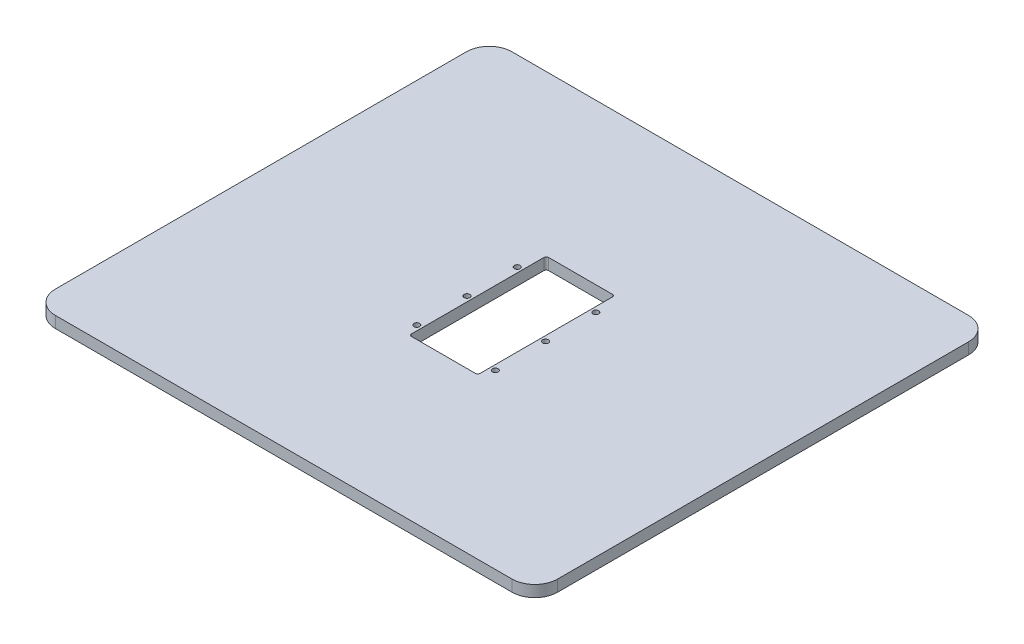
ISO-10303-21;
HEADER;
FILE_DESCRIPTION(('STEP AP214'),'2;1');
FILE_NAME('part.step','',(''),(''),'','','');
FILE_SCHEMA(('AUTOMOTIVE_DESIGN { 1 0 10303 214 1 1 1 1 }'));
ENDSEC;
DATA;
#1=APPLICATION_CONTEXT('core data for automotive mechanical design processes');
#2=APPLICATION_PROTOCOL_DEFINITION('international standard','automotive_design',2000,#1);
#3=PRODUCT_CONTEXT('',#1,'mechanical');
#4=PRODUCT('Part','Part','',(#3));
#5=PRODUCT_RELATED_PRODUCT_CATEGORY('part','',(#4));
#6=PRODUCT_DEFINITION_FORMATION('','',#4);
#7=PRODUCT_DEFINITION_CONTEXT('part definition',#1,'design');
#8=PRODUCT_DEFINITION('design','',#6,#7);
#9=PRODUCT_DEFINITION_SHAPE('','',#8);
#10=(LENGTH_UNIT() NAMED_UNIT(*) SI_UNIT(.MILLI.,.METRE.));
#11=(NAMED_UNIT(*) PLANE_ANGLE_UNIT() SI_UNIT($,.RADIAN.));
#12=(NAMED_UNIT(*) SI_UNIT($,.STERADIAN.) SOLID_ANGLE_UNIT());
#13=UNCERTAINTY_MEASURE_WITH_UNIT(LENGTH_MEASURE(1.E-05),#10,'distance_accuracy_value','');
#14=(GEOMETRIC_REPRESENTATION_CONTEXT(3) GLOBAL_UNCERTAINTY_ASSIGNED_CONTEXT((#13)) GLOBAL_UNIT_ASSIGNED_CONTEXT((#10,
#11,#12)) REPRESENTATION_CONTEXT('',''));
#15=CARTESIAN_POINT('',(0.,0.,0.));
#16=DIRECTION('',(0.,0.,1.));
#17=DIRECTION('',(1.,0.,0.));
#18=AXIS2_PLACEMENT_3D('',#15,#16,#17);
#19=CARTESIAN_POINT('',(99.9999999999998,5.,90.));
#20=DIRECTION('',(0.,1.,0.));
#21=DIRECTION('',(0.,0.,1.));
#22=AXIS2_PLACEMENT_3D('',#19,#20,#21);
#23=PLANE('',#22);
#24=CARTESIAN_POINT('',(-17.2,5.,2.50000000000002));
#25=DIRECTION('',(0.,1.,0.));
#26=DIRECTION('',(0.,0.,-1.));
#27=AXIS2_PLACEMENT_3D('',#24,#25,#26);
#28=CIRCLE('',#27,1.24999999999999);
#29=CARTESIAN_POINT('',(-17.2,5.,1.25000000000003));
#30=VERTEX_POINT('',#29);
#31=EDGE_CURVE('E416',#30,#30,#28,.T.);
#32=ORIENTED_EDGE('',*,*,#31,.F.);
#33=EDGE_LOOP('',(#32));
#34=FACE_BOUND('',#33,.T.);
#35=CARTESIAN_POINT('',(17.2,5.,24.5));
#36=DIRECTION('',(0.,1.,0.));
#37=DIRECTION('',(0.,0.,1.));
#38=AXIS2_PLACEMENT_3D('',#35,#36,#37);
#39=CIRCLE('',#38,1.25);
#40=CARTESIAN_POINT('',(17.2,5.,25.75));
#41=VERTEX_POINT('',#40);
#42=EDGE_CURVE('E184',#41,#41,#39,.T.);
#43=ORIENTED_EDGE('',*,*,#42,.F.);
#44=EDGE_LOOP('',(#43));
#45=FACE_BOUND('',#44,.T.);
#46=CARTESIAN_POINT('',(17.2,5.,-19.5));
#47=DIRECTION('',(0.,1.,0.));
#48=DIRECTION('',(0.,0.,1.));
#49=AXIS2_PLACEMENT_3D('',#46,#47,#48);
#50=CIRCLE('',#49,1.25);
#51=CARTESIAN_POINT('',(17.2,5.,-18.25));
#52=VERTEX_POINT('',#51);
#53=EDGE_CURVE('E220',#52,#52,#50,.T.);
#54=ORIENTED_EDGE('',*,*,#53,.F.);
#55=EDGE_LOOP('',(#54));
#56=FACE_BOUND('',#55,.T.);
#57=CARTESIAN_POINT('',(99.9999999999998,5.,90.));
#58=DIRECTION('',(0.,1.,0.));
#59=DIRECTION('',(0.,0.,1.));
#60=AXIS2_PLACEMENT_3D('',#57,#58,#59);
#61=CIRCLE('',#60,10.);
#62=CARTESIAN_POINT('',(99.9999999999998,5.,100.));
#63=VERTEX_POINT('',#62);
#64=CARTESIAN_POINT('',(110.,5.,90.));
#65=VERTEX_POINT('',#64);
#66=EDGE_CURVE('E226',#63,#65,#61,.T.);
#67=ORIENTED_EDGE('',*,*,#66,.T.);
#68=DIRECTION('',(0.,0.,-1.));
#69=VECTOR('',#68,1.);
#70=CARTESIAN_POINT('',(110.,5.,90.));
#71=LINE('',#70,#69);
#72=CARTESIAN_POINT('',(110.,5.,-90.));
#73=VERTEX_POINT('',#72);
#74=EDGE_CURVE('E229',#65,#73,#71,.T.);
#75=ORIENTED_EDGE('',*,*,#74,.T.);
#76=CARTESIAN_POINT('',(99.9999999999998,5.,-90.));
#77=DIRECTION('',(0.,1.,0.));
#78=DIRECTION('',(0.,0.,1.));
#79=AXIS2_PLACEMENT_3D('',#76,#77,#78);
#80=CIRCLE('',#79,10.);
#81=CARTESIAN_POINT('',(99.9999999999998,5.,-100.));
#82=VERTEX_POINT('',#81);
#83=EDGE_CURVE('E232',#73,#82,#80,.T.);
#84=ORIENTED_EDGE('',*,*,#83,.T.);
#85=DIRECTION('',(-1.,0.,0.));
#86=VECTOR('',#85,1.);
#87=CARTESIAN_POINT('',(99.9999999999998,5.,-100.));
#88=LINE('',#87,#86);
#89=CARTESIAN_POINT('',(-100.,5.,-100.));
#90=VERTEX_POINT('',#89);
#91=EDGE_CURVE('E234',#82,#90,#88,.T.);
#92=ORIENTED_EDGE('',*,*,#91,.T.);
#93=CARTESIAN_POINT('',(-100.,5.,-90.));
#94=DIRECTION('',(0.,1.,0.));
#95=DIRECTION('',(0.,0.,1.));
#96=AXIS2_PLACEMENT_3D('',#93,#94,#95);
#97=CIRCLE('',#96,10.);
#98=CARTESIAN_POINT('',(-110.,5.,-90.));
#99=VERTEX_POINT('',#98);
#100=EDGE_CURVE('E236',#90,#99,#97,.T.);
#101=ORIENTED_EDGE('',*,*,#100,.T.);
#102=DIRECTION('',(0.,0.,1.));
#103=VECTOR('',#102,1.);
#104=CARTESIAN_POINT('',(-110.,5.,90.));
#105=LINE('',#104,#103);
#106=CARTESIAN_POINT('',(-110.,5.,90.));
#107=VERTEX_POINT('',#106);
#108=EDGE_CURVE('E238',#99,#107,#105,.T.);
#109=ORIENTED_EDGE('',*,*,#108,.T.);
#110=CARTESIAN_POINT('',(-100.,5.,90.));
#111=DIRECTION('',(0.,1.,0.));
#112=DIRECTION('',(0.,0.,-1.));
#113=AXIS2_PLACEMENT_3D('',#110,#111,#112);
#114=CIRCLE('',#113,10.);
#115=CARTESIAN_POINT('',(-100.,5.,100.));
#116=VERTEX_POINT('',#115);
#117=EDGE_CURVE('E240',#107,#116,#114,.T.);
#118=ORIENTED_EDGE('',*,*,#117,.T.);
#119=DIRECTION('',(1.,0.,0.));
#120=VECTOR('',#119,1.);
#121=CARTESIAN_POINT('',(99.9999999999998,5.,100.));
#122=LINE('',#121,#120);
#123=EDGE_CURVE('E242',#116,#63,#122,.T.);
#124=ORIENTED_EDGE('',*,*,#123,.T.);
#125=EDGE_LOOP('',(#67,#75,#84,#92,#101,#109,#118,#124));
#126=FACE_BOUND('',#125,.T.);
#127=CARTESIAN_POINT('',(17.2,5.,2.50000000000002));
#128=DIRECTION('',(0.,1.,0.));
#129=DIRECTION('',(0.,0.,1.));
#130=AXIS2_PLACEMENT_3D('',#127,#128,#129);
#131=CIRCLE('',#130,1.25);
#132=CARTESIAN_POINT('',(17.2,5.,3.75000000000002));
#133=VERTEX_POINT('',#132);
#134=EDGE_CURVE('E214',#133,#133,#131,.T.);
#135=ORIENTED_EDGE('',*,*,#134,.F.);
#136=EDGE_LOOP('',(#135));
#137=FACE_BOUND('',#136,.T.);
#138=DIRECTION('',(0.,0.,-1.));
#139=VECTOR('',#138,1.);
#140=CARTESIAN_POINT('',(15.,5.,-29.));
#141=LINE('',#140,#139);
#142=CARTESIAN_POINT('',(15.,5.,29.));
#143=VERTEX_POINT('',#142);
#144=CARTESIAN_POINT('',(15.,5.,-29.));
#145=VERTEX_POINT('',#144);
#146=EDGE_CURVE('E154',#143,#145,#141,.T.);
#147=ORIENTED_EDGE('',*,*,#146,.F.);
#148=CARTESIAN_POINT('',(14.,5.,29.));
#149=DIRECTION('',(0.,1.,0.));
#150=DIRECTION('',(0.,0.,-1.));
#151=AXIS2_PLACEMENT_3D('',#148,#149,#150);
#152=CIRCLE('',#151,0.999999999999999);
#153=CARTESIAN_POINT('',(14.,5.,30.));
#154=VERTEX_POINT('',#153);
#155=EDGE_CURVE('E146',#154,#143,#152,.T.);
#156=ORIENTED_EDGE('',*,*,#155,.F.);
#157=DIRECTION('',(1.,0.,0.));
#158=VECTOR('',#157,1.);
#159=CARTESIAN_POINT('',(14.,5.,30.));
#160=LINE('',#159,#158);
#161=CARTESIAN_POINT('',(-14.,5.,30.));
#162=VERTEX_POINT('',#161);
#163=EDGE_CURVE('E181',#162,#154,#160,.T.);
#164=ORIENTED_EDGE('',*,*,#163,.F.);
#165=CARTESIAN_POINT('',(-14.,5.,29.));
#166=DIRECTION('',(0.,1.,0.));
#167=DIRECTION('',(0.,0.,-1.));
#168=AXIS2_PLACEMENT_3D('',#165,#166,#167);
#169=CIRCLE('',#168,0.999999999999999);
#170=CARTESIAN_POINT('',(-15.,5.,29.));
#171=VERTEX_POINT('',#170);
#172=EDGE_CURVE('E179',#171,#162,#169,.T.);
#173=ORIENTED_EDGE('',*,*,#172,.F.);
#174=DIRECTION('',(0.,0.,1.));
#175=VECTOR('',#174,1.);
#176=CARTESIAN_POINT('',(-15.,5.,-29.));
#177=LINE('',#176,#175);
#178=CARTESIAN_POINT('',(-15.,5.,-29.));
#179=VERTEX_POINT('',#178);
#180=EDGE_CURVE('E177',#179,#171,#177,.T.);
#181=ORIENTED_EDGE('',*,*,#180,.F.);
#182=CARTESIAN_POINT('',(-14.,5.,-29.));
#183=DIRECTION('',(0.,1.,0.));
#184=DIRECTION('',(0.,0.,1.));
#185=AXIS2_PLACEMENT_3D('',#182,#183,#184);
#186=CIRCLE('',#185,0.999999999999997);
#187=CARTESIAN_POINT('',(-14.,5.,-30.));
#188=VERTEX_POINT('',#187);
#189=EDGE_CURVE('E175',#188,#179,#186,.T.);
#190=ORIENTED_EDGE('',*,*,#189,.F.);
#191=DIRECTION('',(-1.,0.,0.));
#192=VECTOR('',#191,1.);
#193=CARTESIAN_POINT('',(14.,5.,-30.));
#194=LINE('',#193,#192);
#195=CARTESIAN_POINT('',(14.,5.,-30.));
#196=VERTEX_POINT('',#195);
#197=EDGE_CURVE('E170',#196,#188,#194,.T.);
#198=ORIENTED_EDGE('',*,*,#197,.F.);
#199=CARTESIAN_POINT('',(14.,5.,-29.));
#200=DIRECTION('',(0.,1.,0.));
#201=DIRECTION('',(0.,0.,-1.));
#202=AXIS2_PLACEMENT_3D('',#199,#200,#201);
#203=CIRCLE('',#202,0.999999999999997);
#204=EDGE_CURVE('E168',#145,#196,#203,.T.);
#205=ORIENTED_EDGE('',*,*,#204,.F.);
#206=EDGE_LOOP('',(#147,#156,#164,#173,#181,#190,#198,#205));
#207=FACE_BOUND('',#206,.T.);
#208=CARTESIAN_POINT('',(-17.2,5.,24.5));
#209=DIRECTION('',(0.,1.,0.));
#210=DIRECTION('',(0.,0.,-1.));
#211=AXIS2_PLACEMENT_3D('',#208,#209,#210);
#212=CIRCLE('',#211,1.24999999999999);
#213=CARTESIAN_POINT('',(-17.2,5.,23.25));
#214=VERTEX_POINT('',#213);
#215=EDGE_CURVE('E422',#214,#214,#212,.T.);
#216=ORIENTED_EDGE('',*,*,#215,.F.);
#217=EDGE_LOOP('',(#216));
#218=FACE_BOUND('',#217,.T.);
#219=CARTESIAN_POINT('',(-17.2,5.,-19.5));
#220=DIRECTION('',(0.,1.,0.));
#221=DIRECTION('',(0.,0.,-1.));
#222=AXIS2_PLACEMENT_3D('',#219,#220,#221);
#223=CIRCLE('',#222,1.24999999999999);
#224=CARTESIAN_POINT('',(-17.2,5.,-20.75));
#225=VERTEX_POINT('',#224);
#226=EDGE_CURVE('E407',#225,#225,#223,.T.);
#227=ORIENTED_EDGE('',*,*,#226,.F.);
#228=EDGE_LOOP('',(#227));
#229=FACE_BOUND('',#228,.T.);
#230=ADVANCED_FACE('F33',(#34,#45,#56,#126,#137,#207,#218,#229),#23,.T.);
#231=CARTESIAN_POINT('',(99.9999999999998,0.,90.));
#232=DIRECTION('',(0.,1.,0.));
#233=DIRECTION('',(0.,0.,1.));
#234=AXIS2_PLACEMENT_3D('',#231,#232,#233);
#235=PLANE('',#234);
#236=CARTESIAN_POINT('',(17.2,0.,2.50000000000002));
#237=DIRECTION('',(0.,1.,0.));
#238=DIRECTION('',(0.,0.,1.));
#239=AXIS2_PLACEMENT_3D('',#236,#237,#238);
#240=CIRCLE('',#239,1.25);
#241=CARTESIAN_POINT('',(17.2,0.,3.75000000000002));
#242=VERTEX_POINT('',#241);
#243=EDGE_CURVE('E162',#242,#242,#240,.T.);
#244=ORIENTED_EDGE('',*,*,#243,.T.);
#245=EDGE_LOOP('',(#244));
#246=FACE_BOUND('',#245,.T.);
#247=CARTESIAN_POINT('',(17.2,0.,-19.5));
#248=DIRECTION('',(0.,1.,0.));
#249=DIRECTION('',(0.,0.,1.));
#250=AXIS2_PLACEMENT_3D('',#247,#248,#249);
#251=CIRCLE('',#250,1.25);
#252=CARTESIAN_POINT('',(17.2,0.,-18.25));
#253=VERTEX_POINT('',#252);
#254=EDGE_CURVE('E217',#253,#253,#251,.T.);
#255=ORIENTED_EDGE('',*,*,#254,.T.);
#256=EDGE_LOOP('',(#255));
#257=FACE_BOUND('',#256,.T.);
#258=CARTESIAN_POINT('',(99.9999999999998,0.,90.));
#259=DIRECTION('',(0.,1.,0.));
#260=DIRECTION('',(0.,0.,1.));
#261=AXIS2_PLACEMENT_3D('',#258,#259,#260);
#262=CIRCLE('',#261,10.);
#263=CARTESIAN_POINT('',(99.9999999999998,0.,100.));
#264=VERTEX_POINT('',#263);
#265=CARTESIAN_POINT('',(110.,0.,90.));
#266=VERTEX_POINT('',#265);
#267=EDGE_CURVE('E223',#264,#266,#262,.T.);
#268=ORIENTED_EDGE('',*,*,#267,.F.);
#269=DIRECTION('',(1.,0.,0.));
#270=VECTOR('',#269,1.);
#271=CARTESIAN_POINT('',(99.9999999999998,0.,100.));
#272=LINE('',#271,#270);
#273=CARTESIAN_POINT('',(-100.,0.,100.));
#274=VERTEX_POINT('',#273);
#275=EDGE_CURVE('E230',#274,#264,#272,.T.);
#276=ORIENTED_EDGE('',*,*,#275,.F.);
#277=CARTESIAN_POINT('',(-100.,0.,90.));
#278=DIRECTION('',(0.,1.,0.));
#279=DIRECTION('',(0.,0.,-1.));
#280=AXIS2_PLACEMENT_3D('',#277,#278,#279);
#281=CIRCLE('',#280,10.);
#282=CARTESIAN_POINT('',(-110.,0.,90.));
#283=VERTEX_POINT('',#282);
#284=EDGE_CURVE('E257',#283,#274,#281,.T.);
#285=ORIENTED_EDGE('',*,*,#284,.F.);
#286=DIRECTION('',(0.,0.,1.));
#287=VECTOR('',#286,1.);
#288=CARTESIAN_POINT('',(-110.,0.,90.));
#289=LINE('',#288,#287);
#290=CARTESIAN_POINT('',(-110.,0.,-90.));
#291=VERTEX_POINT('',#290);
#292=EDGE_CURVE('E255',#291,#283,#289,.T.);
#293=ORIENTED_EDGE('',*,*,#292,.F.);
#294=CARTESIAN_POINT('',(-100.,0.,-90.));
#295=DIRECTION('',(0.,1.,0.));
#296=DIRECTION('',(0.,0.,1.));
#297=AXIS2_PLACEMENT_3D('',#294,#295,#296);
#298=CIRCLE('',#297,10.);
#299=CARTESIAN_POINT('',(-100.,0.,-100.));
#300=VERTEX_POINT('',#299);
#301=EDGE_CURVE('E253',#300,#291,#298,.T.);
#302=ORIENTED_EDGE('',*,*,#301,.F.);
#303=DIRECTION('',(-1.,0.,0.));
#304=VECTOR('',#303,1.);
#305=CARTESIAN_POINT('',(99.9999999999998,0.,-100.));
#306=LINE('',#305,#304);
#307=CARTESIAN_POINT('',(99.9999999999998,0.,-100.));
#308=VERTEX_POINT('',#307);
#309=EDGE_CURVE('E251',#308,#300,#306,.T.);
#310=ORIENTED_EDGE('',*,*,#309,.F.);
#311=CARTESIAN_POINT('',(99.9999999999998,0.,-90.));
#312=DIRECTION('',(0.,1.,0.));
#313=DIRECTION('',(0.,0.,1.));
#314=AXIS2_PLACEMENT_3D('',#311,#312,#313);
#315=CIRCLE('',#314,10.);
#316=CARTESIAN_POINT('',(110.,0.,-90.));
#317=VERTEX_POINT('',#316);
#318=EDGE_CURVE('E249',#317,#308,#315,.T.);
#319=ORIENTED_EDGE('',*,*,#318,.F.);
#320=DIRECTION('',(0.,0.,-1.));
#321=VECTOR('',#320,1.);
#322=CARTESIAN_POINT('',(110.,0.,90.));
#323=LINE('',#322,#321);
#324=EDGE_CURVE('E247',#266,#317,#323,.T.);
#325=ORIENTED_EDGE('',*,*,#324,.F.);
#326=EDGE_LOOP('',(#268,#276,#285,#293,#302,#310,#319,#325));
#327=FACE_BOUND('',#326,.T.);
#328=CARTESIAN_POINT('',(14.,0.,29.));
#329=DIRECTION('',(0.,1.,0.));
#330=DIRECTION('',(0.,0.,-1.));
#331=AXIS2_PLACEMENT_3D('',#328,#329,#330);
#332=CIRCLE('',#331,0.999999999999999);
#333=CARTESIAN_POINT('',(14.,0.,30.));
#334=VERTEX_POINT('',#333);
#335=CARTESIAN_POINT('',(15.,0.,29.));
#336=VERTEX_POINT('',#335);
#337=EDGE_CURVE('E56',#334,#336,#332,.T.);
#338=ORIENTED_EDGE('',*,*,#337,.T.);
#339=DIRECTION('',(0.,0.,-1.));
#340=VECTOR('',#339,1.);
#341=CARTESIAN_POINT('',(15.,0.,-29.));
#342=LINE('',#341,#340);
#343=CARTESIAN_POINT('',(15.,0.,-29.));
#344=VERTEX_POINT('',#343);
#345=EDGE_CURVE('E161',#336,#344,#342,.T.);
#346=ORIENTED_EDGE('',*,*,#345,.T.);
#347=CARTESIAN_POINT('',(14.,0.,-29.));
#348=DIRECTION('',(0.,1.,0.));
#349=DIRECTION('',(0.,0.,-1.));
#350=AXIS2_PLACEMENT_3D('',#347,#348,#349);
#351=CIRCLE('',#350,0.999999999999997);
#352=CARTESIAN_POINT('',(14.,0.,-30.));
#353=VERTEX_POINT('',#352);
#354=EDGE_CURVE('E186',#344,#353,#351,.T.);
#355=ORIENTED_EDGE('',*,*,#354,.T.);
#356=DIRECTION('',(-1.,0.,0.));
#357=VECTOR('',#356,1.);
#358=CARTESIAN_POINT('',(14.,0.,-30.));
#359=LINE('',#358,#357);
#360=CARTESIAN_POINT('',(-14.,0.,-30.));
#361=VERTEX_POINT('',#360);
#362=EDGE_CURVE('E189',#353,#361,#359,.T.);
#363=ORIENTED_EDGE('',*,*,#362,.T.);
#364=CARTESIAN_POINT('',(-14.,0.,-29.));
#365=DIRECTION('',(0.,1.,0.));
#366=DIRECTION('',(0.,0.,1.));
#367=AXIS2_PLACEMENT_3D('',#364,#365,#366);
#368=CIRCLE('',#367,0.999999999999997);
#369=CARTESIAN_POINT('',(-15.,0.,-29.));
#370=VERTEX_POINT('',#369);
#371=EDGE_CURVE('E192',#361,#370,#368,.T.);
#372=ORIENTED_EDGE('',*,*,#371,.T.);
#373=DIRECTION('',(0.,0.,1.));
#374=VECTOR('',#373,1.);
#375=CARTESIAN_POINT('',(-15.,0.,-29.));
#376=LINE('',#375,#374);
#377=CARTESIAN_POINT('',(-15.,0.,29.));
#378=VERTEX_POINT('',#377);
#379=EDGE_CURVE('E195',#370,#378,#376,.T.);
#380=ORIENTED_EDGE('',*,*,#379,.T.);
#381=CARTESIAN_POINT('',(-14.,0.,29.));
#382=DIRECTION('',(0.,1.,0.));
#383=DIRECTION('',(0.,0.,-1.));
#384=AXIS2_PLACEMENT_3D('',#381,#382,#383);
#385=CIRCLE('',#384,0.999999999999999);
#386=CARTESIAN_POINT('',(-14.,0.,30.));
#387=VERTEX_POINT('',#386);
#388=EDGE_CURVE('E198',#378,#387,#385,.T.);
#389=ORIENTED_EDGE('',*,*,#388,.T.);
#390=DIRECTION('',(1.,0.,0.));
#391=VECTOR('',#390,1.);
#392=CARTESIAN_POINT('',(14.,0.,30.));
#393=LINE('',#392,#391);
#394=EDGE_CURVE('E155',#387,#334,#393,.T.);
#395=ORIENTED_EDGE('',*,*,#394,.T.);
#396=EDGE_LOOP('',(#338,#346,#355,#363,#372,#380,#389,#395));
#397=FACE_BOUND('',#396,.T.);
#398=CARTESIAN_POINT('',(17.2,0.,24.5));
#399=DIRECTION('',(0.,1.,0.));
#400=DIRECTION('',(0.,0.,1.));
#401=AXIS2_PLACEMENT_3D('',#398,#399,#400);
#402=CIRCLE('',#401,1.25);
#403=CARTESIAN_POINT('',(17.2,0.,25.75));
#404=VERTEX_POINT('',#403);
#405=EDGE_CURVE('E425',#404,#404,#402,.T.);
#406=ORIENTED_EDGE('',*,*,#405,.T.);
#407=EDGE_LOOP('',(#406));
#408=FACE_BOUND('',#407,.T.);
#409=CARTESIAN_POINT('',(-17.2,0.,24.5));
#410=DIRECTION('',(0.,1.,0.));
#411=DIRECTION('',(0.,0.,-1.));
#412=AXIS2_PLACEMENT_3D('',#409,#410,#411);
#413=CIRCLE('',#412,1.24999999999999);
#414=CARTESIAN_POINT('',(-17.2,0.,23.25));
#415=VERTEX_POINT('',#414);
#416=EDGE_CURVE('E419',#415,#415,#413,.T.);
#417=ORIENTED_EDGE('',*,*,#416,.T.);
#418=EDGE_LOOP('',(#417));
#419=FACE_BOUND('',#418,.T.);
#420=CARTESIAN_POINT('',(-17.2,0.,2.50000000000002));
#421=DIRECTION('',(0.,1.,0.));
#422=DIRECTION('',(0.,0.,-1.));
#423=AXIS2_PLACEMENT_3D('',#420,#421,#422);
#424=CIRCLE('',#423,1.24999999999999);
#425=CARTESIAN_POINT('',(-17.2,0.,1.25000000000003));
#426=VERTEX_POINT('',#425);
#427=EDGE_CURVE('E413',#426,#426,#424,.T.);
#428=ORIENTED_EDGE('',*,*,#427,.T.);
#429=EDGE_LOOP('',(#428));
#430=FACE_BOUND('',#429,.T.);
#431=CARTESIAN_POINT('',(-17.2,0.,-19.5));
#432=DIRECTION('',(0.,1.,0.));
#433=DIRECTION('',(0.,0.,-1.));
#434=AXIS2_PLACEMENT_3D('',#431,#432,#433);
#435=CIRCLE('',#434,1.24999999999999);
#436=CARTESIAN_POINT('',(-17.2,0.,-20.75));
#437=VERTEX_POINT('',#436);
#438=EDGE_CURVE('E410',#437,#437,#435,.T.);
#439=ORIENTED_EDGE('',*,*,#438,.T.);
#440=EDGE_LOOP('',(#439));
#441=FACE_BOUND('',#440,.T.);
#442=ADVANCED_FACE('F287',(#246,#257,#327,#397,#408,#419,#430,#441),#235,.F.);
#443=CARTESIAN_POINT('',(99.9999999999998,5.,90.));
#444=DIRECTION('',(0.,-1.,0.));
#445=DIRECTION('',(0.,0.,-1.));
#446=AXIS2_PLACEMENT_3D('',#443,#444,#445);
#447=CYLINDRICAL_SURFACE('',#446,10.);
#448=ORIENTED_EDGE('',*,*,#267,.T.);
#449=DIRECTION('',(0.,-1.,0.));
#450=VECTOR('',#449,1.);
#451=CARTESIAN_POINT('',(110.,5.,90.));
#452=LINE('',#451,#450);
#453=EDGE_CURVE('E11',#65,#266,#452,.T.);
#454=ORIENTED_EDGE('',*,*,#453,.F.);
#455=ORIENTED_EDGE('',*,*,#66,.F.);
#456=DIRECTION('',(0.,-1.,0.));
#457=VECTOR('',#456,1.);
#458=CARTESIAN_POINT('',(99.9999999999998,5.,100.));
#459=LINE('',#458,#457);
#460=EDGE_CURVE('E244',#63,#264,#459,.T.);
#461=ORIENTED_EDGE('',*,*,#460,.T.);
#462=EDGE_LOOP('',(#448,#454,#455,#461));
#463=FACE_BOUND('',#462,.T.);
#464=ADVANCED_FACE('F35',(#463),#447,.T.);
#465=CARTESIAN_POINT('',(110.,5.,90.));
#466=DIRECTION('',(-1.,0.,0.));
#467=DIRECTION('',(0.,0.,1.));
#468=AXIS2_PLACEMENT_3D('',#465,#466,#467);
#469=PLANE('',#468);
#470=ORIENTED_EDGE('',*,*,#324,.T.);
#471=DIRECTION('',(0.,-1.,0.));
#472=VECTOR('',#471,1.);
#473=CARTESIAN_POINT('',(110.,5.,-90.));
#474=LINE('',#473,#472);
#475=EDGE_CURVE('E41',#73,#317,#474,.T.);
#476=ORIENTED_EDGE('',*,*,#475,.F.);
#477=ORIENTED_EDGE('',*,*,#74,.F.);
#478=ORIENTED_EDGE('',*,*,#453,.T.);
#479=EDGE_LOOP('',(#470,#476,#477,#478));
#480=FACE_BOUND('',#479,.T.);
#481=ADVANCED_FACE('F305',(#480),#469,.F.);
#482=CARTESIAN_POINT('',(99.9999999999998,5.,-90.));
#483=DIRECTION('',(0.,-1.,0.));
#484=DIRECTION('',(0.,0.,-1.));
#485=AXIS2_PLACEMENT_3D('',#482,#483,#484);
#486=CYLINDRICAL_SURFACE('',#485,10.);
#487=ORIENTED_EDGE('',*,*,#318,.T.);
#488=DIRECTION('',(0.,-1.,0.));
#489=VECTOR('',#488,1.);
#490=CARTESIAN_POINT('',(99.9999999999998,5.,-100.));
#491=LINE('',#490,#489);
#492=EDGE_CURVE('E274',#82,#308,#491,.T.);
#493=ORIENTED_EDGE('',*,*,#492,.F.);
#494=ORIENTED_EDGE('',*,*,#83,.F.);
#495=ORIENTED_EDGE('',*,*,#475,.T.);
#496=EDGE_LOOP('',(#487,#493,#494,#495));
#497=FACE_BOUND('',#496,.T.);
#498=ADVANCED_FACE('F281',(#497),#486,.T.);
#499=CARTESIAN_POINT('',(99.9999999999998,5.,-100.));
#500=DIRECTION('',(0.,0.,1.));
#501=DIRECTION('',(1.,0.,0.));
#502=AXIS2_PLACEMENT_3D('',#499,#500,#501);
#503=PLANE('',#502);
#504=ORIENTED_EDGE('',*,*,#309,.T.);
#505=DIRECTION('',(0.,-1.,0.));
#506=VECTOR('',#505,1.);
#507=CARTESIAN_POINT('',(-100.,5.,-100.));
#508=LINE('',#507,#506);
#509=EDGE_CURVE('E271',#90,#300,#508,.T.);
#510=ORIENTED_EDGE('',*,*,#509,.F.);
#511=ORIENTED_EDGE('',*,*,#91,.F.);
#512=ORIENTED_EDGE('',*,*,#492,.T.);
#513=EDGE_LOOP('',(#504,#510,#511,#512));
#514=FACE_BOUND('',#513,.T.);
#515=ADVANCED_FACE('F293',(#514),#503,.F.);
#516=CARTESIAN_POINT('',(-100.,5.,-90.));
#517=DIRECTION('',(0.,-1.,0.));
#518=DIRECTION('',(0.,0.,-1.));
#519=AXIS2_PLACEMENT_3D('',#516,#517,#518);
#520=CYLINDRICAL_SURFACE('',#519,10.);
#521=ORIENTED_EDGE('',*,*,#301,.T.);
#522=DIRECTION('',(0.,-1.,0.));
#523=VECTOR('',#522,1.);
#524=CARTESIAN_POINT('',(-110.,5.,-90.));
#525=LINE('',#524,#523);
#526=EDGE_CURVE('E268',#99,#291,#525,.T.);
#527=ORIENTED_EDGE('',*,*,#526,.F.);
#528=ORIENTED_EDGE('',*,*,#100,.F.);
#529=ORIENTED_EDGE('',*,*,#509,.T.);
#530=EDGE_LOOP('',(#521,#527,#528,#529));
#531=FACE_BOUND('',#530,.T.);
#532=ADVANCED_FACE('F297',(#531),#520,.T.);
#533=CARTESIAN_POINT('',(-110.,5.,90.));
#534=DIRECTION('',(1.,0.,0.));
#535=DIRECTION('',(0.,0.,-1.));
#536=AXIS2_PLACEMENT_3D('',#533,#534,#535);
#537=PLANE('',#536);
#538=ORIENTED_EDGE('',*,*,#292,.T.);
#539=DIRECTION('',(0.,-1.,0.));
#540=VECTOR('',#539,1.);
#541=CARTESIAN_POINT('',(-110.,5.,90.));
#542=LINE('',#541,#540);
#543=EDGE_CURVE('E265',#107,#283,#542,.T.);
#544=ORIENTED_EDGE('',*,*,#543,.F.);
#545=ORIENTED_EDGE('',*,*,#108,.F.);
#546=ORIENTED_EDGE('',*,*,#526,.T.);
#547=EDGE_LOOP('',(#538,#544,#545,#546));
#548=FACE_BOUND('',#547,.T.);
#549=ADVANCED_FACE('F318',(#548),#537,.F.);
#550=CARTESIAN_POINT('',(-100.,5.,90.));
#551=DIRECTION('',(0.,-1.,0.));
#552=DIRECTION('',(0.,0.,-1.));
#553=AXIS2_PLACEMENT_3D('',#550,#551,#552);
#554=CYLINDRICAL_SURFACE('',#553,10.);
#555=ORIENTED_EDGE('',*,*,#284,.T.);
#556=DIRECTION('',(0.,-1.,0.));
#557=VECTOR('',#556,1.);
#558=CARTESIAN_POINT('',(-100.,5.,100.));
#559=LINE('',#558,#557);
#560=EDGE_CURVE('E262',#116,#274,#559,.T.);
#561=ORIENTED_EDGE('',*,*,#560,.F.);
#562=ORIENTED_EDGE('',*,*,#117,.F.);
#563=ORIENTED_EDGE('',*,*,#543,.T.);
#564=EDGE_LOOP('',(#555,#561,#562,#563));
#565=FACE_BOUND('',#564,.T.);
#566=ADVANCED_FACE('F316',(#565),#554,.T.);
#567=CARTESIAN_POINT('',(99.9999999999998,5.,100.));
#568=DIRECTION('',(0.,0.,-1.));
#569=DIRECTION('',(-1.,0.,0.));
#570=AXIS2_PLACEMENT_3D('',#567,#568,#569);
#571=PLANE('',#570);
#572=ORIENTED_EDGE('',*,*,#275,.T.);
#573=ORIENTED_EDGE('',*,*,#460,.F.);
#574=ORIENTED_EDGE('',*,*,#123,.F.);
#575=ORIENTED_EDGE('',*,*,#560,.T.);
#576=EDGE_LOOP('',(#572,#573,#574,#575));
#577=FACE_BOUND('',#576,.T.);
#578=ADVANCED_FACE('F311',(#577),#571,.F.);
#579=CARTESIAN_POINT('',(17.2,5.,-19.5));
#580=DIRECTION('',(0.,-1.,0.));
#581=DIRECTION('',(0.,0.,-1.));
#582=AXIS2_PLACEMENT_3D('',#579,#580,#581);
#583=CYLINDRICAL_SURFACE('',#582,1.25);
#584=ORIENTED_EDGE('',*,*,#53,.T.);
#585=EDGE_LOOP('',(#584));
#586=FACE_BOUND('',#585,.T.);
#587=ORIENTED_EDGE('',*,*,#254,.F.);
#588=EDGE_LOOP('',(#587));
#589=FACE_BOUND('',#588,.T.);
#590=ADVANCED_FACE('F338',(#586,#589),#583,.F.);
#591=CARTESIAN_POINT('',(17.2,5.,2.50000000000002));
#592=DIRECTION('',(0.,-1.,0.));
#593=DIRECTION('',(0.,0.,-1.));
#594=AXIS2_PLACEMENT_3D('',#591,#592,#593);
#595=CYLINDRICAL_SURFACE('',#594,1.25);
#596=ORIENTED_EDGE('',*,*,#134,.T.);
#597=EDGE_LOOP('',(#596));
#598=FACE_BOUND('',#597,.T.);
#599=ORIENTED_EDGE('',*,*,#243,.F.);
#600=EDGE_LOOP('',(#599));
#601=FACE_BOUND('',#600,.T.);
#602=ADVANCED_FACE('F345',(#598,#601),#595,.F.);
#603=CARTESIAN_POINT('',(14.,5.,29.));
#604=DIRECTION('',(0.,-1.,0.));
#605=DIRECTION('',(0.,0.,-1.));
#606=AXIS2_PLACEMENT_3D('',#603,#604,#605);
#607=CYLINDRICAL_SURFACE('',#606,0.999999999999999);
#608=ORIENTED_EDGE('',*,*,#337,.F.);
#609=DIRECTION('',(0.,-1.,0.));
#610=VECTOR('',#609,1.);
#611=CARTESIAN_POINT('',(14.,5.,30.));
#612=LINE('',#611,#610);
#613=EDGE_CURVE('E150',#154,#334,#612,.T.);
#614=ORIENTED_EDGE('',*,*,#613,.F.);
#615=ORIENTED_EDGE('',*,*,#155,.T.);
#616=DIRECTION('',(0.,-1.,0.));
#617=VECTOR('',#616,1.);
#618=CARTESIAN_POINT('',(15.,5.,29.));
#619=LINE('',#618,#617);
#620=EDGE_CURVE('E149',#143,#336,#619,.T.);
#621=ORIENTED_EDGE('',*,*,#620,.T.);
#622=EDGE_LOOP('',(#608,#614,#615,#621));
#623=FACE_BOUND('',#622,.T.);
#624=ADVANCED_FACE('F148',(#623),#607,.F.);
#625=CARTESIAN_POINT('',(15.,5.,-29.));
#626=DIRECTION('',(-1.,0.,0.));
#627=DIRECTION('',(0.,0.,1.));
#628=AXIS2_PLACEMENT_3D('',#625,#626,#627);
#629=PLANE('',#628);
#630=ORIENTED_EDGE('',*,*,#345,.F.);
#631=ORIENTED_EDGE('',*,*,#620,.F.);
#632=ORIENTED_EDGE('',*,*,#146,.T.);
#633=DIRECTION('',(0.,-1.,0.));
#634=VECTOR('',#633,1.);
#635=CARTESIAN_POINT('',(15.,5.,-29.));
#636=LINE('',#635,#634);
#637=EDGE_CURVE('E163',#145,#344,#636,.T.);
#638=ORIENTED_EDGE('',*,*,#637,.T.);
#639=EDGE_LOOP('',(#630,#631,#632,#638));
#640=FACE_BOUND('',#639,.T.);
#641=ADVANCED_FACE('F158',(#640),#629,.T.);
#642=CARTESIAN_POINT('',(14.,5.,-29.));
#643=DIRECTION('',(0.,-1.,0.));
#644=DIRECTION('',(0.,0.,-1.));
#645=AXIS2_PLACEMENT_3D('',#642,#643,#644);
#646=CYLINDRICAL_SURFACE('',#645,0.999999999999997);
#647=ORIENTED_EDGE('',*,*,#354,.F.);
#648=ORIENTED_EDGE('',*,*,#637,.F.);
#649=ORIENTED_EDGE('',*,*,#204,.T.);
#650=DIRECTION('',(0.,-1.,0.));
#651=VECTOR('',#650,1.);
#652=CARTESIAN_POINT('',(14.,5.,-30.));
#653=LINE('',#652,#651);
#654=EDGE_CURVE('E211',#196,#353,#653,.T.);
#655=ORIENTED_EDGE('',*,*,#654,.T.);
#656=EDGE_LOOP('',(#647,#648,#649,#655));
#657=FACE_BOUND('',#656,.T.);
#658=ADVANCED_FACE('F364',(#657),#646,.F.);
#659=CARTESIAN_POINT('',(14.,5.,-30.));
#660=DIRECTION('',(0.,0.,1.));
#661=DIRECTION('',(1.,0.,0.));
#662=AXIS2_PLACEMENT_3D('',#659,#660,#661);
#663=PLANE('',#662);
#664=ORIENTED_EDGE('',*,*,#362,.F.);
#665=ORIENTED_EDGE('',*,*,#654,.F.);
#666=ORIENTED_EDGE('',*,*,#197,.T.);
#667=DIRECTION('',(0.,-1.,0.));
#668=VECTOR('',#667,1.);
#669=CARTESIAN_POINT('',(-14.,5.,-30.));
#670=LINE('',#669,#668);
#671=EDGE_CURVE('E209',#188,#361,#670,.T.);
#672=ORIENTED_EDGE('',*,*,#671,.T.);
#673=EDGE_LOOP('',(#664,#665,#666,#672));
#674=FACE_BOUND('',#673,.T.);
#675=ADVANCED_FACE('F367',(#674),#663,.T.);
#676=CARTESIAN_POINT('',(-14.,5.,-29.));
#677=DIRECTION('',(0.,-1.,0.));
#678=DIRECTION('',(0.,0.,-1.));
#679=AXIS2_PLACEMENT_3D('',#676,#677,#678);
#680=CYLINDRICAL_SURFACE('',#679,0.999999999999997);
#681=ORIENTED_EDGE('',*,*,#371,.F.);
#682=ORIENTED_EDGE('',*,*,#671,.F.);
#683=ORIENTED_EDGE('',*,*,#189,.T.);
#684=DIRECTION('',(0.,-1.,0.));
#685=VECTOR('',#684,1.);
#686=CARTESIAN_POINT('',(-15.,5.,-29.));
#687=LINE('',#686,#685);
#688=EDGE_CURVE('E207',#179,#370,#687,.T.);
#689=ORIENTED_EDGE('',*,*,#688,.T.);
#690=EDGE_LOOP('',(#681,#682,#683,#689));
#691=FACE_BOUND('',#690,.T.);
#692=ADVANCED_FACE('F371',(#691),#680,.F.);
#693=CARTESIAN_POINT('',(-15.,5.,-29.));
#694=DIRECTION('',(1.,0.,0.));
#695=DIRECTION('',(0.,0.,-1.));
#696=AXIS2_PLACEMENT_3D('',#693,#694,#695);
#697=PLANE('',#696);
#698=ORIENTED_EDGE('',*,*,#379,.F.);
#699=ORIENTED_EDGE('',*,*,#688,.F.);
#700=ORIENTED_EDGE('',*,*,#180,.T.);
#701=DIRECTION('',(0.,-1.,0.));
#702=VECTOR('',#701,1.);
#703=CARTESIAN_POINT('',(-15.,5.,29.));
#704=LINE('',#703,#702);
#705=EDGE_CURVE('E205',#171,#378,#704,.T.);
#706=ORIENTED_EDGE('',*,*,#705,.T.);
#707=EDGE_LOOP('',(#698,#699,#700,#706));
#708=FACE_BOUND('',#707,.T.);
#709=ADVANCED_FACE('F375',(#708),#697,.T.);
#710=CARTESIAN_POINT('',(-14.,5.,29.));
#711=DIRECTION('',(0.,-1.,0.));
#712=DIRECTION('',(0.,0.,-1.));
#713=AXIS2_PLACEMENT_3D('',#710,#711,#712);
#714=CYLINDRICAL_SURFACE('',#713,0.999999999999999);
#715=ORIENTED_EDGE('',*,*,#388,.F.);
#716=ORIENTED_EDGE('',*,*,#705,.F.);
#717=ORIENTED_EDGE('',*,*,#172,.T.);
#718=DIRECTION('',(0.,-1.,0.));
#719=VECTOR('',#718,1.);
#720=CARTESIAN_POINT('',(-14.,5.,30.));
#721=LINE('',#720,#719);
#722=EDGE_CURVE('E48',#162,#387,#721,.T.);
#723=ORIENTED_EDGE('',*,*,#722,.T.);
#724=EDGE_LOOP('',(#715,#716,#717,#723));
#725=FACE_BOUND('',#724,.T.);
#726=ADVANCED_FACE('F379',(#725),#714,.F.);
#727=CARTESIAN_POINT('',(14.,5.,30.));
#728=DIRECTION('',(0.,0.,-1.));
#729=DIRECTION('',(-1.,0.,0.));
#730=AXIS2_PLACEMENT_3D('',#727,#728,#729);
#731=PLANE('',#730);
#732=ORIENTED_EDGE('',*,*,#394,.F.);
#733=ORIENTED_EDGE('',*,*,#722,.F.);
#734=ORIENTED_EDGE('',*,*,#163,.T.);
#735=ORIENTED_EDGE('',*,*,#613,.T.);
#736=EDGE_LOOP('',(#732,#733,#734,#735));
#737=FACE_BOUND('',#736,.T.);
#738=ADVANCED_FACE('F383',(#737),#731,.T.);
#739=CARTESIAN_POINT('',(17.2,5.,24.5));
#740=DIRECTION('',(0.,-1.,0.));
#741=DIRECTION('',(0.,0.,-1.));
#742=AXIS2_PLACEMENT_3D('',#739,#740,#741);
#743=CYLINDRICAL_SURFACE('',#742,1.25);
#744=ORIENTED_EDGE('',*,*,#42,.T.);
#745=EDGE_LOOP('',(#744));
#746=FACE_BOUND('',#745,.T.);
#747=ORIENTED_EDGE('',*,*,#405,.F.);
#748=EDGE_LOOP('',(#747));
#749=FACE_BOUND('',#748,.T.);
#750=ADVANCED_FACE('F387',(#746,#749),#743,.F.);
#751=CARTESIAN_POINT('',(-17.2,5.,24.5));
#752=DIRECTION('',(0.,-1.,0.));
#753=DIRECTION('',(0.,0.,-1.));
#754=AXIS2_PLACEMENT_3D('',#751,#752,#753);
#755=CYLINDRICAL_SURFACE('',#754,1.24999999999999);
#756=ORIENTED_EDGE('',*,*,#215,.T.);
#757=EDGE_LOOP('',(#756));
#758=FACE_BOUND('',#757,.T.);
#759=ORIENTED_EDGE('',*,*,#416,.F.);
#760=EDGE_LOOP('',(#759));
#761=FACE_BOUND('',#760,.T.);
#762=ADVANCED_FACE('F390',(#758,#761),#755,.F.);
#763=CARTESIAN_POINT('',(-17.2,5.,2.50000000000002));
#764=DIRECTION('',(0.,-1.,0.));
#765=DIRECTION('',(0.,0.,-1.));
#766=AXIS2_PLACEMENT_3D('',#763,#764,#765);
#767=CYLINDRICAL_SURFACE('',#766,1.24999999999999);
#768=ORIENTED_EDGE('',*,*,#31,.T.);
#769=EDGE_LOOP('',(#768));
#770=FACE_BOUND('',#769,.T.);
#771=ORIENTED_EDGE('',*,*,#427,.F.);
#772=EDGE_LOOP('',(#771));
#773=FACE_BOUND('',#772,.T.);
#774=ADVANCED_FACE('F394',(#770,#773),#767,.F.);
#775=CARTESIAN_POINT('',(-17.2,5.,-19.5));
#776=DIRECTION('',(0.,-1.,0.));
#777=DIRECTION('',(0.,0.,-1.));
#778=AXIS2_PLACEMENT_3D('',#775,#776,#777);
#779=CYLINDRICAL_SURFACE('',#778,1.24999999999999);
#780=ORIENTED_EDGE('',*,*,#226,.T.);
#781=EDGE_LOOP('',(#780));
#782=FACE_BOUND('',#781,.T.);
#783=ORIENTED_EDGE('',*,*,#438,.F.);
#784=EDGE_LOOP('',(#783));
#785=FACE_BOUND('',#784,.T.);
#786=ADVANCED_FACE('F398',(#782,#785),#779,.F.);
#787=CLOSED_SHELL('',(#230,#442,#464,#481,#498,#515,#532,#549,#566,#578,#590,#602,#624,#641,
#658,#675,#692,#709,#726,#738,#750,#762,#774,#786));
#788=MANIFOLD_SOLID_BREP('B2',#787);
#789=ADVANCED_BREP_SHAPE_REPRESENTATION('',(#18,#788),#14);
#790=SHAPE_DEFINITION_REPRESENTATION(#9,#789);
ENDSEC;
END-ISO-10303-21;
